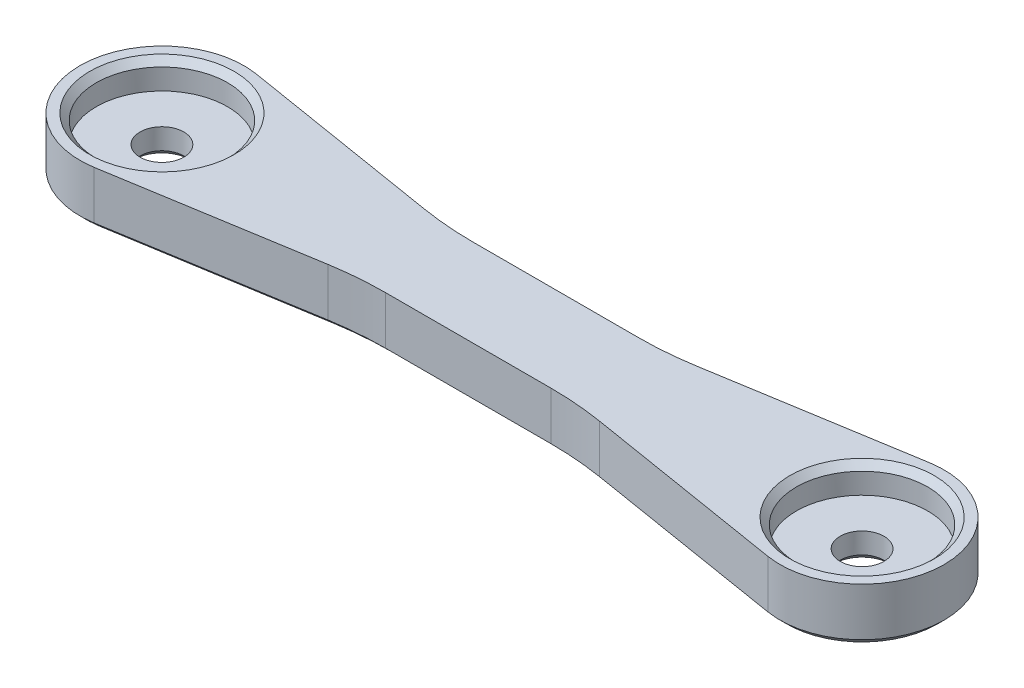
ISO-10303-21;
HEADER;
FILE_DESCRIPTION(('STEP AP214'),'2;1');
FILE_NAME('part.step','',(''),(''),'','','');
FILE_SCHEMA(('AUTOMOTIVE_DESIGN { 1 0 10303 214 1 1 1 1 }'));
ENDSEC;
DATA;
#1=APPLICATION_CONTEXT('core data for automotive mechanical design processes');
#2=APPLICATION_PROTOCOL_DEFINITION('international standard','automotive_design',2000,#1);
#3=PRODUCT_CONTEXT('',#1,'mechanical');
#4=PRODUCT('Part','Part','',(#3));
#5=PRODUCT_RELATED_PRODUCT_CATEGORY('part','',(#4));
#6=PRODUCT_DEFINITION_FORMATION('','',#4);
#7=PRODUCT_DEFINITION_CONTEXT('part definition',#1,'design');
#8=PRODUCT_DEFINITION('design','',#6,#7);
#9=PRODUCT_DEFINITION_SHAPE('','',#8);
#10=(LENGTH_UNIT() NAMED_UNIT(*) SI_UNIT(.MILLI.,.METRE.));
#11=(NAMED_UNIT(*) PLANE_ANGLE_UNIT() SI_UNIT($,.RADIAN.));
#12=(NAMED_UNIT(*) SI_UNIT($,.STERADIAN.) SOLID_ANGLE_UNIT());
#13=UNCERTAINTY_MEASURE_WITH_UNIT(LENGTH_MEASURE(1.E-05),#10,'distance_accuracy_value','');
#14=(GEOMETRIC_REPRESENTATION_CONTEXT(3) GLOBAL_UNCERTAINTY_ASSIGNED_CONTEXT((#13)) GLOBAL_UNIT_ASSIGNED_CONTEXT((#10,
#11,#12)) REPRESENTATION_CONTEXT('',''));
#15=CARTESIAN_POINT('',(0.,0.,0.));
#16=DIRECTION('',(0.,0.,1.));
#17=DIRECTION('',(1.,0.,0.));
#18=AXIS2_PLACEMENT_3D('',#15,#16,#17);
#19=CARTESIAN_POINT('',(-32.,-5.,0.));
#20=DIRECTION('',(0.,1.,0.));
#21=DIRECTION('',(0.,0.,1.));
#22=AXIS2_PLACEMENT_3D('',#19,#20,#21);
#23=CYLINDRICAL_SURFACE('',#22,2.);
#24=CARTESIAN_POINT('',(-32.,-4.39999999999999,0.));
#25=DIRECTION('',(0.,-1.,0.));
#26=DIRECTION('',(0.,0.,-1.));
#27=AXIS2_PLACEMENT_3D('',#24,#25,#26);
#28=CIRCLE('',#27,2.);
#29=CARTESIAN_POINT('',(-32.,-4.39999999999999,-2.));
#30=VERTEX_POINT('',#29);
#31=EDGE_CURVE('E343',#30,#30,#28,.T.);
#32=ORIENTED_EDGE('',*,*,#31,.T.);
#33=EDGE_LOOP('',(#32));
#34=FACE_BOUND('',#33,.T.);
#35=CARTESIAN_POINT('',(-32.,-2.5,0.));
#36=DIRECTION('',(0.,1.,0.));
#37=DIRECTION('',(0.,0.,1.));
#38=AXIS2_PLACEMENT_3D('',#35,#36,#37);
#39=CIRCLE('',#38,2.);
#40=CARTESIAN_POINT('',(-32.,-2.5,2.00000000000001));
#41=VERTEX_POINT('',#40);
#42=EDGE_CURVE('E384',#41,#41,#39,.T.);
#43=ORIENTED_EDGE('',*,*,#42,.T.);
#44=EDGE_LOOP('',(#43));
#45=FACE_BOUND('',#44,.T.);
#46=ADVANCED_FACE('F91',(#34,#45),#23,.F.);
#47=CARTESIAN_POINT('',(32.,-5.,0.));
#48=DIRECTION('',(0.,1.,0.));
#49=DIRECTION('',(0.,0.,1.));
#50=AXIS2_PLACEMENT_3D('',#47,#48,#49);
#51=CYLINDRICAL_SURFACE('',#50,2.);
#52=CARTESIAN_POINT('',(32.,-4.39999999999999,0.));
#53=DIRECTION('',(0.,-1.,0.));
#54=DIRECTION('',(0.,0.,-1.));
#55=AXIS2_PLACEMENT_3D('',#52,#53,#54);
#56=CIRCLE('',#55,2.);
#57=CARTESIAN_POINT('',(32.,-4.39999999999999,-2.00000000000001));
#58=VERTEX_POINT('',#57);
#59=EDGE_CURVE('E346',#58,#58,#56,.T.);
#60=ORIENTED_EDGE('',*,*,#59,.T.);
#61=EDGE_LOOP('',(#60));
#62=FACE_BOUND('',#61,.T.);
#63=CARTESIAN_POINT('',(32.,-2.5,0.));
#64=DIRECTION('',(0.,1.,0.));
#65=DIRECTION('',(0.,0.,1.));
#66=AXIS2_PLACEMENT_3D('',#63,#64,#65);
#67=CIRCLE('',#66,2.);
#68=CARTESIAN_POINT('',(32.,-2.5,2.));
#69=VERTEX_POINT('',#68);
#70=EDGE_CURVE('E409',#69,#69,#67,.T.);
#71=ORIENTED_EDGE('',*,*,#70,.T.);
#72=EDGE_LOOP('',(#71));
#73=FACE_BOUND('',#72,.T.);
#74=ADVANCED_FACE('F438',(#62,#73),#51,.F.);
#75=CARTESIAN_POINT('',(-30.7889224659765,-5.,-7.40157356287048));
#76=DIRECTION('',(-0.161477004536472,0.,0.9868764750494));
#77=DIRECTION('',(0.9868764750494,0.,0.161477004536472));
#78=AXIS2_PLACEMENT_3D('',#75,#76,#77);
#79=PLANE('',#78);
#80=DIRECTION('',(0.,1.,0.));
#81=VECTOR('',#80,1.);
#82=CARTESIAN_POINT('',(-12.4061564828965,-5.,-4.39370574851801));
#83=LINE('',#82,#81);
#84=CARTESIAN_POINT('',(-12.4061564828965,0.,-4.39370574851801));
#85=VERTEX_POINT('',#84);
#86=CARTESIAN_POINT('',(-12.4061564828965,-4.39999999999999,-4.39370574851801));
#87=VERTEX_POINT('',#86);
#88=EDGE_CURVE('E270',#85,#87,#83,.F.);
#89=ORIENTED_EDGE('',*,*,#88,.T.);
#90=DIRECTION('',(-0.9868764750494,0.,-0.161477004536472));
#91=VECTOR('',#90,1.);
#92=CARTESIAN_POINT('',(-30.7889224659765,-4.39999999999999,-7.40157356287048));
#93=LINE('',#92,#91);
#94=CARTESIAN_POINT('',(-30.7889224659765,-4.39999999999999,-7.40157356287048));
#95=VERTEX_POINT('',#94);
#96=EDGE_CURVE('E341',#87,#95,#93,.T.);
#97=ORIENTED_EDGE('',*,*,#96,.T.);
#98=DIRECTION('',(0.,1.,0.));
#99=VECTOR('',#98,1.);
#100=CARTESIAN_POINT('',(-30.7889224659765,-5.,-7.40157356287048));
#101=LINE('',#100,#99);
#102=CARTESIAN_POINT('',(-30.7889224659765,0.,-7.40157356287048));
#103=VERTEX_POINT('',#102);
#104=EDGE_CURVE('E260',#95,#103,#101,.T.);
#105=ORIENTED_EDGE('',*,*,#104,.T.);
#106=DIRECTION('',(0.986876475049399,0.,0.161477004536472));
#107=VECTOR('',#106,1.);
#108=CARTESIAN_POINT('',(-30.7889224659765,0.,-7.40157356287048));
#109=LINE('',#108,#107);
#110=EDGE_CURVE('E246',#103,#85,#109,.T.);
#111=ORIENTED_EDGE('',*,*,#110,.T.);
#112=EDGE_LOOP('',(#89,#97,#105,#111));
#113=FACE_BOUND('',#112,.T.);
#114=ADVANCED_FACE('F444',(#113),#79,.F.);
#115=CARTESIAN_POINT('',(-10.,-5.,-4.));
#116=DIRECTION('',(0.,0.,1.));
#117=DIRECTION('',(1.,0.,0.));
#118=AXIS2_PLACEMENT_3D('',#115,#116,#117);
#119=PLANE('',#118);
#120=DIRECTION('',(0.,1.,0.));
#121=VECTOR('',#120,1.);
#122=CARTESIAN_POINT('',(7.56184634680233,-5.,-4.));
#123=LINE('',#122,#121);
#124=CARTESIAN_POINT('',(7.56184634680233,0.,-4.));
#125=VERTEX_POINT('',#124);
#126=CARTESIAN_POINT('',(7.56184634680233,-4.39999999999999,-4.));
#127=VERTEX_POINT('',#126);
#128=EDGE_CURVE('E268',#125,#127,#123,.F.);
#129=ORIENTED_EDGE('',*,*,#128,.T.);
#130=DIRECTION('',(-1.,0.,0.));
#131=VECTOR('',#130,1.);
#132=CARTESIAN_POINT('',(-7.56184634680231,-4.39999999999999,-4.));
#133=LINE('',#132,#131);
#134=CARTESIAN_POINT('',(-7.56184634680231,-4.39999999999999,-4.));
#135=VERTEX_POINT('',#134);
#136=EDGE_CURVE('E114',#127,#135,#133,.T.);
#137=ORIENTED_EDGE('',*,*,#136,.T.);
#138=DIRECTION('',(0.,1.,0.));
#139=VECTOR('',#138,1.);
#140=CARTESIAN_POINT('',(-7.56184634680231,0.,-4.));
#141=LINE('',#140,#139);
#142=CARTESIAN_POINT('',(-7.56184634680231,0.,-4.));
#143=VERTEX_POINT('',#142);
#144=EDGE_CURVE('E266',#135,#143,#141,.T.);
#145=ORIENTED_EDGE('',*,*,#144,.T.);
#146=DIRECTION('',(1.,0.,0.));
#147=VECTOR('',#146,1.);
#148=CARTESIAN_POINT('',(-10.,0.,-4.));
#149=LINE('',#148,#147);
#150=EDGE_CURVE('E243',#143,#125,#149,.T.);
#151=ORIENTED_EDGE('',*,*,#150,.T.);
#152=EDGE_LOOP('',(#129,#137,#145,#151));
#153=FACE_BOUND('',#152,.T.);
#154=ADVANCED_FACE('F474',(#153),#119,.F.);
#155=CARTESIAN_POINT('',(30.7889224659764,-5.,-7.40157356287052));
#156=DIRECTION('',(-0.161477004536474,0.,-0.986876475049399));
#157=DIRECTION('',(-0.986876475049399,0.,0.161477004536474));
#158=AXIS2_PLACEMENT_3D('',#155,#156,#157);
#159=PLANE('',#158);
#160=DIRECTION('',(0.,1.,0.));
#161=VECTOR('',#160,1.);
#162=CARTESIAN_POINT('',(30.7889224659764,-5.,-7.40157356287051));
#163=LINE('',#162,#161);
#164=CARTESIAN_POINT('',(30.7889224659764,-4.39999999999999,-7.40157356287051));
#165=VERTEX_POINT('',#164);
#166=CARTESIAN_POINT('',(30.7889224659764,0.,-7.40157356287051));
#167=VERTEX_POINT('',#166);
#168=EDGE_CURVE('E218',#165,#167,#163,.T.);
#169=ORIENTED_EDGE('',*,*,#168,.F.);
#170=DIRECTION('',(-0.986876475049399,0.,0.161477004536474));
#171=VECTOR('',#170,1.);
#172=CARTESIAN_POINT('',(30.7889224659764,-4.39999999999999,-7.40157356287052));
#173=LINE('',#172,#171);
#174=CARTESIAN_POINT('',(12.4061564828965,-4.39999999999999,-4.39370574851802));
#175=VERTEX_POINT('',#174);
#176=EDGE_CURVE('E335',#165,#175,#173,.T.);
#177=ORIENTED_EDGE('',*,*,#176,.T.);
#178=DIRECTION('',(0.,1.,0.));
#179=VECTOR('',#178,1.);
#180=CARTESIAN_POINT('',(12.4061564828965,-5.,-4.39370574851802));
#181=LINE('',#180,#179);
#182=CARTESIAN_POINT('',(12.4061564828965,0.,-4.39370574851803));
#183=VERTEX_POINT('',#182);
#184=EDGE_CURVE('E229',#175,#183,#181,.T.);
#185=ORIENTED_EDGE('',*,*,#184,.T.);
#186=DIRECTION('',(-0.986876475049399,0.,0.161477004536474));
#187=VECTOR('',#186,1.);
#188=CARTESIAN_POINT('',(30.7889224659764,0.,-7.40157356287052));
#189=LINE('',#188,#187);
#190=EDGE_CURVE('E236',#167,#183,#189,.T.);
#191=ORIENTED_EDGE('',*,*,#190,.F.);
#192=EDGE_LOOP('',(#169,#177,#185,#191));
#193=FACE_BOUND('',#192,.T.);
#194=ADVANCED_FACE('F240',(#193),#159,.T.);
#195=CARTESIAN_POINT('',(32.,-5.,0.));
#196=DIRECTION('',(0.,1.,0.));
#197=DIRECTION('',(0.,0.,1.));
#198=AXIS2_PLACEMENT_3D('',#195,#196,#197);
#199=CYLINDRICAL_SURFACE('',#198,7.50000000000001);
#200=DIRECTION('',(0.,1.,0.));
#201=VECTOR('',#200,1.);
#202=CARTESIAN_POINT('',(30.7889224659764,-5.,7.4015735628705));
#203=LINE('',#202,#201);
#204=CARTESIAN_POINT('',(30.7889224659764,-4.39999999999999,7.4015735628705));
#205=VERTEX_POINT('',#204);
#206=CARTESIAN_POINT('',(30.7889224659764,0.,7.4015735628705));
#207=VERTEX_POINT('',#206);
#208=EDGE_CURVE('E230',#205,#207,#203,.T.);
#209=ORIENTED_EDGE('',*,*,#208,.F.);
#210=CARTESIAN_POINT('',(32.,-4.39999999999999,0.));
#211=DIRECTION('',(0.,-1.,0.));
#212=DIRECTION('',(0.,0.,-1.));
#213=AXIS2_PLACEMENT_3D('',#210,#211,#212);
#214=CIRCLE('',#213,7.50000000000001);
#215=EDGE_CURVE('E225',#205,#165,#214,.F.);
#216=ORIENTED_EDGE('',*,*,#215,.T.);
#217=ORIENTED_EDGE('',*,*,#168,.T.);
#218=CARTESIAN_POINT('',(32.,0.,0.));
#219=DIRECTION('',(0.,-1.,0.));
#220=DIRECTION('',(0.,0.,-1.));
#221=AXIS2_PLACEMENT_3D('',#218,#219,#220);
#222=CIRCLE('',#221,7.50000000000001);
#223=EDGE_CURVE('E222',#167,#207,#222,.T.);
#224=ORIENTED_EDGE('',*,*,#223,.T.);
#225=EDGE_LOOP('',(#209,#216,#217,#224));
#226=FACE_BOUND('',#225,.T.);
#227=ADVANCED_FACE('F221',(#226),#199,.T.);
#228=CARTESIAN_POINT('',(30.7889224659764,-5.,7.4015735628705));
#229=DIRECTION('',(0.161477004536473,0.,-0.9868764750494));
#230=DIRECTION('',(-0.9868764750494,0.,-0.161477004536473));
#231=AXIS2_PLACEMENT_3D('',#228,#229,#230);
#232=PLANE('',#231);
#233=DIRECTION('',(0.,1.,0.));
#234=VECTOR('',#233,1.);
#235=CARTESIAN_POINT('',(12.4061564828965,-5.,4.39370574851801));
#236=LINE('',#235,#234);
#237=CARTESIAN_POINT('',(12.4061564828965,0.,4.39370574851801));
#238=VERTEX_POINT('',#237);
#239=CARTESIAN_POINT('',(12.4061564828965,-4.39999999999999,4.39370574851801));
#240=VERTEX_POINT('',#239);
#241=EDGE_CURVE('E277',#238,#240,#236,.F.);
#242=ORIENTED_EDGE('',*,*,#241,.T.);
#243=DIRECTION('',(0.9868764750494,0.,0.161477004536473));
#244=VECTOR('',#243,1.);
#245=CARTESIAN_POINT('',(30.7889224659764,-4.39999999999999,7.4015735628705));
#246=LINE('',#245,#244);
#247=EDGE_CURVE('E332',#240,#205,#246,.T.);
#248=ORIENTED_EDGE('',*,*,#247,.T.);
#249=ORIENTED_EDGE('',*,*,#208,.T.);
#250=DIRECTION('',(-0.986876475049399,0.,-0.161477004536473));
#251=VECTOR('',#250,1.);
#252=CARTESIAN_POINT('',(30.7889224659764,0.,7.4015735628705));
#253=LINE('',#252,#251);
#254=EDGE_CURVE('E238',#207,#238,#253,.T.);
#255=ORIENTED_EDGE('',*,*,#254,.T.);
#256=EDGE_LOOP('',(#242,#248,#249,#255));
#257=FACE_BOUND('',#256,.T.);
#258=ADVANCED_FACE('F465',(#257),#232,.F.);
#259=CARTESIAN_POINT('',(10.,-5.,4.));
#260=DIRECTION('',(0.,0.,-1.));
#261=DIRECTION('',(-1.,0.,0.));
#262=AXIS2_PLACEMENT_3D('',#259,#260,#261);
#263=PLANE('',#262);
#264=DIRECTION('',(0.,1.,0.));
#265=VECTOR('',#264,1.);
#266=CARTESIAN_POINT('',(-7.56184634680234,-5.,4.));
#267=LINE('',#266,#265);
#268=CARTESIAN_POINT('',(-7.56184634680234,0.,4.));
#269=VERTEX_POINT('',#268);
#270=CARTESIAN_POINT('',(-7.56184634680234,-4.39999999999999,4.));
#271=VERTEX_POINT('',#270);
#272=EDGE_CURVE('E272',#269,#271,#267,.F.);
#273=ORIENTED_EDGE('',*,*,#272,.T.);
#274=DIRECTION('',(1.,0.,0.));
#275=VECTOR('',#274,1.);
#276=CARTESIAN_POINT('',(7.5618463468023,-4.39999999999999,4.));
#277=LINE('',#276,#275);
#278=CARTESIAN_POINT('',(7.5618463468023,-4.39999999999999,4.));
#279=VERTEX_POINT('',#278);
#280=EDGE_CURVE('E328',#271,#279,#277,.T.);
#281=ORIENTED_EDGE('',*,*,#280,.T.);
#282=DIRECTION('',(0.,1.,0.));
#283=VECTOR('',#282,1.);
#284=CARTESIAN_POINT('',(7.5618463468023,0.,4.));
#285=LINE('',#284,#283);
#286=CARTESIAN_POINT('',(7.5618463468023,0.,4.));
#287=VERTEX_POINT('',#286);
#288=EDGE_CURVE('E275',#279,#287,#285,.T.);
#289=ORIENTED_EDGE('',*,*,#288,.T.);
#290=DIRECTION('',(-1.,0.,0.));
#291=VECTOR('',#290,1.);
#292=CARTESIAN_POINT('',(10.,0.,4.));
#293=LINE('',#292,#291);
#294=EDGE_CURVE('E251',#287,#269,#293,.T.);
#295=ORIENTED_EDGE('',*,*,#294,.T.);
#296=EDGE_LOOP('',(#273,#281,#289,#295));
#297=FACE_BOUND('',#296,.T.);
#298=ADVANCED_FACE('F461',(#297),#263,.F.);
#299=CARTESIAN_POINT('',(-30.7889224659765,-5.,7.4015735628705));
#300=DIRECTION('',(0.161477004536473,0.,0.9868764750494));
#301=DIRECTION('',(0.9868764750494,0.,-0.161477004536473));
#302=AXIS2_PLACEMENT_3D('',#299,#300,#301);
#303=PLANE('',#302);
#304=DIRECTION('',(0.,1.,0.));
#305=VECTOR('',#304,1.);
#306=CARTESIAN_POINT('',(-30.7889224659765,-5.,7.40157356287051));
#307=LINE('',#306,#305);
#308=CARTESIAN_POINT('',(-30.7889224659765,-4.39999999999999,7.40157356287051));
#309=VERTEX_POINT('',#308);
#310=CARTESIAN_POINT('',(-30.7889224659765,0.,7.40157356287051));
#311=VERTEX_POINT('',#310);
#312=EDGE_CURVE('E262',#309,#311,#307,.T.);
#313=ORIENTED_EDGE('',*,*,#312,.F.);
#314=DIRECTION('',(0.9868764750494,0.,-0.161477004536473));
#315=VECTOR('',#314,1.);
#316=CARTESIAN_POINT('',(-30.7889224659765,-4.39999999999999,7.4015735628705));
#317=LINE('',#316,#315);
#318=CARTESIAN_POINT('',(-12.4061564828965,-4.39999999999999,4.39370574851802));
#319=VERTEX_POINT('',#318);
#320=EDGE_CURVE('E324',#309,#319,#317,.T.);
#321=ORIENTED_EDGE('',*,*,#320,.T.);
#322=DIRECTION('',(0.,1.,0.));
#323=VECTOR('',#322,1.);
#324=CARTESIAN_POINT('',(-12.4061564828965,-5.,4.39370574851802));
#325=LINE('',#324,#323);
#326=CARTESIAN_POINT('',(-12.4061564828965,0.,4.39370574851802));
#327=VERTEX_POINT('',#326);
#328=EDGE_CURVE('E280',#319,#327,#325,.T.);
#329=ORIENTED_EDGE('',*,*,#328,.T.);
#330=DIRECTION('',(0.986876475049399,0.,-0.161477004536473));
#331=VECTOR('',#330,1.);
#332=CARTESIAN_POINT('',(-30.7889224659765,0.,7.4015735628705));
#333=LINE('',#332,#331);
#334=EDGE_CURVE('E254',#311,#327,#333,.T.);
#335=ORIENTED_EDGE('',*,*,#334,.F.);
#336=EDGE_LOOP('',(#313,#321,#329,#335));
#337=FACE_BOUND('',#336,.T.);
#338=ADVANCED_FACE('F457',(#337),#303,.T.);
#339=CARTESIAN_POINT('',(-32.,-5.,0.));
#340=DIRECTION('',(0.,1.,0.));
#341=DIRECTION('',(0.,0.,1.));
#342=AXIS2_PLACEMENT_3D('',#339,#340,#341);
#343=CYLINDRICAL_SURFACE('',#342,7.5);
#344=ORIENTED_EDGE('',*,*,#104,.F.);
#345=CARTESIAN_POINT('',(-32.,-4.39999999999999,0.));
#346=DIRECTION('',(0.,-1.,0.));
#347=DIRECTION('',(0.,0.,-1.));
#348=AXIS2_PLACEMENT_3D('',#345,#346,#347);
#349=CIRCLE('',#348,7.5);
#350=EDGE_CURVE('E290',#95,#309,#349,.F.);
#351=ORIENTED_EDGE('',*,*,#350,.T.);
#352=ORIENTED_EDGE('',*,*,#312,.T.);
#353=CARTESIAN_POINT('',(-32.,0.,0.));
#354=DIRECTION('',(0.,1.,0.));
#355=DIRECTION('',(0.,0.,1.));
#356=AXIS2_PLACEMENT_3D('',#353,#354,#355);
#357=CIRCLE('',#356,7.5);
#358=EDGE_CURVE('E257',#103,#311,#357,.T.);
#359=ORIENTED_EDGE('',*,*,#358,.F.);
#360=EDGE_LOOP('',(#344,#351,#352,#359));
#361=FACE_BOUND('',#360,.T.);
#362=ADVANCED_FACE('F451',(#361),#343,.T.);
#363=CARTESIAN_POINT('',(32.,-5.,0.));
#364=DIRECTION('',(0.,-1.,0.));
#365=DIRECTION('',(0.,0.,-1.));
#366=AXIS2_PLACEMENT_3D('',#363,#364,#365);
#367=PLANE('',#366);
#368=DIRECTION('',(-0.986876475049399,0.,0.161477004536473));
#369=VECTOR('',#368,1.);
#370=CARTESIAN_POINT('',(31.445402659681,-5.,-3.38945517262252));
#371=LINE('',#370,#369);
#372=CARTESIAN_POINT('',(-12.5030426856184,-5.,3.80157986348838));
#373=VERTEX_POINT('',#372);
#374=CARTESIAN_POINT('',(-30.8858086686984,-5.,6.80944767784087));
#375=VERTEX_POINT('',#374);
#376=EDGE_CURVE('E319',#373,#375,#371,.T.);
#377=ORIENTED_EDGE('',*,*,#376,.T.);
#378=CARTESIAN_POINT('',(-32.,-5.,0.));
#379=DIRECTION('',(0.,-1.,0.));
#380=DIRECTION('',(0.,0.,-1.));
#381=AXIS2_PLACEMENT_3D('',#378,#379,#380);
#382=CIRCLE('',#381,6.9);
#383=CARTESIAN_POINT('',(-30.8858086686984,-5.,-6.80944767784085));
#384=VERTEX_POINT('',#383);
#385=EDGE_CURVE('E321',#375,#384,#382,.T.);
#386=ORIENTED_EDGE('',*,*,#385,.T.);
#387=DIRECTION('',(0.9868764750494,0.,0.161477004536472));
#388=VECTOR('',#387,1.);
#389=CARTESIAN_POINT('',(-12.5030426856184,-5.,-3.80157986348837));
#390=LINE('',#389,#388);
#391=CARTESIAN_POINT('',(-12.5030426856184,-5.,-3.80157986348837));
#392=VERTEX_POINT('',#391);
#393=EDGE_CURVE('E299',#384,#392,#390,.T.);
#394=ORIENTED_EDGE('',*,*,#393,.T.);
#395=CARTESIAN_POINT('',(-7.56184634680232,-5.,-34.));
#396=DIRECTION('',(0.,-1.,0.));
#397=DIRECTION('',(0.,0.,-1.));
#398=AXIS2_PLACEMENT_3D('',#395,#396,#397);
#399=CIRCLE('',#398,30.6);
#400=CARTESIAN_POINT('',(-7.56184634680231,-5.,-3.4));
#401=VERTEX_POINT('',#400);
#402=EDGE_CURVE('E301',#392,#401,#399,.F.);
#403=ORIENTED_EDGE('',*,*,#402,.T.);
#404=DIRECTION('',(1.,0.,0.));
#405=VECTOR('',#404,1.);
#406=CARTESIAN_POINT('',(7.56184634680233,-5.,-3.4));
#407=LINE('',#406,#405);
#408=CARTESIAN_POINT('',(7.56184634680233,-5.,-3.4));
#409=VERTEX_POINT('',#408);
#410=EDGE_CURVE('E303',#401,#409,#407,.T.);
#411=ORIENTED_EDGE('',*,*,#410,.T.);
#412=CARTESIAN_POINT('',(7.56184634680232,-5.,-34.));
#413=DIRECTION('',(0.,-1.,0.));
#414=DIRECTION('',(0.,0.,-1.));
#415=AXIS2_PLACEMENT_3D('',#412,#413,#414);
#416=CIRCLE('',#415,30.6);
#417=CARTESIAN_POINT('',(12.5030426856184,-5.,-3.80157986348838));
#418=VERTEX_POINT('',#417);
#419=EDGE_CURVE('E305',#409,#418,#416,.F.);
#420=ORIENTED_EDGE('',*,*,#419,.T.);
#421=DIRECTION('',(0.986876475049399,0.,-0.161477004536474));
#422=VECTOR('',#421,1.);
#423=CARTESIAN_POINT('',(30.8858086686983,-5.,-6.80944767784088));
#424=LINE('',#423,#422);
#425=CARTESIAN_POINT('',(30.8858086686983,-5.,-6.80944767784088));
#426=VERTEX_POINT('',#425);
#427=EDGE_CURVE('E307',#418,#426,#424,.T.);
#428=ORIENTED_EDGE('',*,*,#427,.T.);
#429=CARTESIAN_POINT('',(32.,-5.,0.));
#430=DIRECTION('',(0.,-1.,0.));
#431=DIRECTION('',(0.,0.,-1.));
#432=AXIS2_PLACEMENT_3D('',#429,#430,#431);
#433=CIRCLE('',#432,6.90000000000001);
#434=CARTESIAN_POINT('',(30.8858086686983,-5.,6.80944767784087));
#435=VERTEX_POINT('',#434);
#436=EDGE_CURVE('E309',#426,#435,#433,.T.);
#437=ORIENTED_EDGE('',*,*,#436,.T.);
#438=DIRECTION('',(-0.986876475049399,0.,-0.161477004536473));
#439=VECTOR('',#438,1.);
#440=CARTESIAN_POINT('',(12.5030426856184,-5.,3.80157986348837));
#441=LINE('',#440,#439);
#442=CARTESIAN_POINT('',(12.5030426856184,-5.,3.80157986348837));
#443=VERTEX_POINT('',#442);
#444=EDGE_CURVE('E311',#435,#443,#441,.T.);
#445=ORIENTED_EDGE('',*,*,#444,.T.);
#446=CARTESIAN_POINT('',(7.5618463468023,-5.,34.));
#447=DIRECTION('',(0.,-1.,0.));
#448=DIRECTION('',(0.,0.,-1.));
#449=AXIS2_PLACEMENT_3D('',#446,#447,#448);
#450=CIRCLE('',#449,30.6);
#451=CARTESIAN_POINT('',(7.5618463468023,-5.,3.4));
#452=VERTEX_POINT('',#451);
#453=EDGE_CURVE('E313',#443,#452,#450,.F.);
#454=ORIENTED_EDGE('',*,*,#453,.T.);
#455=DIRECTION('',(-1.,0.,0.));
#456=VECTOR('',#455,1.);
#457=CARTESIAN_POINT('',(-7.56184634680234,-5.,3.4));
#458=LINE('',#457,#456);
#459=CARTESIAN_POINT('',(-7.56184634680234,-5.,3.4));
#460=VERTEX_POINT('',#459);
#461=EDGE_CURVE('E315',#452,#460,#458,.T.);
#462=ORIENTED_EDGE('',*,*,#461,.T.);
#463=CARTESIAN_POINT('',(-7.56184634680233,-5.,34.));
#464=DIRECTION('',(0.,-1.,0.));
#465=DIRECTION('',(0.,0.,-1.));
#466=AXIS2_PLACEMENT_3D('',#463,#464,#465);
#467=CIRCLE('',#466,30.6);
#468=EDGE_CURVE('E317',#460,#373,#467,.F.);
#469=ORIENTED_EDGE('',*,*,#468,.T.);
#470=EDGE_LOOP('',(#377,#386,#394,#403,#411,#420,#428,#437,#445,#454,#462,#469));
#471=FACE_BOUND('',#470,.T.);
#472=CARTESIAN_POINT('',(-32.,-5.,0.));
#473=DIRECTION('',(0.,-1.,0.));
#474=DIRECTION('',(0.,0.,-1.));
#475=AXIS2_PLACEMENT_3D('',#472,#473,#474);
#476=CIRCLE('',#475,2.60000000000001);
#477=CARTESIAN_POINT('',(-32.,-5.,-2.60000000000001));
#478=VERTEX_POINT('',#477);
#479=EDGE_CURVE('E296',#478,#478,#476,.F.);
#480=ORIENTED_EDGE('',*,*,#479,.T.);
#481=EDGE_LOOP('',(#480));
#482=FACE_BOUND('',#481,.T.);
#483=CARTESIAN_POINT('',(32.,-5.,0.));
#484=DIRECTION('',(0.,-1.,0.));
#485=DIRECTION('',(0.,0.,-1.));
#486=AXIS2_PLACEMENT_3D('',#483,#484,#485);
#487=CIRCLE('',#486,2.60000000000001);
#488=CARTESIAN_POINT('',(32.,-5.,-2.60000000000001));
#489=VERTEX_POINT('',#488);
#490=EDGE_CURVE('E293',#489,#489,#487,.F.);
#491=ORIENTED_EDGE('',*,*,#490,.T.);
#492=EDGE_LOOP('',(#491));
#493=FACE_BOUND('',#492,.T.);
#494=ADVANCED_FACE('F448',(#471,#482,#493),#367,.T.);
#495=CARTESIAN_POINT('',(32.,0.,0.));
#496=DIRECTION('',(0.,-1.,0.));
#497=DIRECTION('',(0.,0.,-1.));
#498=AXIS2_PLACEMENT_3D('',#495,#496,#497);
#499=PLANE('',#498);
#500=CARTESIAN_POINT('',(32.,0.,0.));
#501=DIRECTION('',(0.,-1.,0.));
#502=DIRECTION('',(0.,0.,-1.));
#503=AXIS2_PLACEMENT_3D('',#500,#501,#502);
#504=CIRCLE('',#503,6.60000000000002);
#505=CARTESIAN_POINT('',(32.,0.,-6.60000000000002));
#506=VERTEX_POINT('',#505);
#507=EDGE_CURVE('E99',#506,#506,#504,.T.);
#508=ORIENTED_EDGE('',*,*,#507,.T.);
#509=EDGE_LOOP('',(#508));
#510=FACE_BOUND('',#509,.T.);
#511=CARTESIAN_POINT('',(-32.,0.,0.));
#512=DIRECTION('',(0.,-1.,0.));
#513=DIRECTION('',(0.,0.,-1.));
#514=AXIS2_PLACEMENT_3D('',#511,#512,#513);
#515=CIRCLE('',#514,6.59999999999998);
#516=CARTESIAN_POINT('',(-32.,0.,-6.59999999999997));
#517=VERTEX_POINT('',#516);
#518=EDGE_CURVE('E387',#517,#517,#515,.T.);
#519=ORIENTED_EDGE('',*,*,#518,.T.);
#520=EDGE_LOOP('',(#519));
#521=FACE_BOUND('',#520,.T.);
#522=ORIENTED_EDGE('',*,*,#110,.F.);
#523=ORIENTED_EDGE('',*,*,#358,.T.);
#524=ORIENTED_EDGE('',*,*,#334,.T.);
#525=CARTESIAN_POINT('',(-7.56184634680233,0.,34.));
#526=DIRECTION('',(0.,-1.,0.));
#527=DIRECTION('',(0.,0.,-1.));
#528=AXIS2_PLACEMENT_3D('',#525,#526,#527);
#529=CIRCLE('',#528,30.);
#530=EDGE_CURVE('E288',#327,#269,#529,.T.);
#531=ORIENTED_EDGE('',*,*,#530,.T.);
#532=ORIENTED_EDGE('',*,*,#294,.F.);
#533=CARTESIAN_POINT('',(7.5618463468023,0.,34.));
#534=DIRECTION('',(0.,-1.,0.));
#535=DIRECTION('',(0.,0.,-1.));
#536=AXIS2_PLACEMENT_3D('',#533,#534,#535);
#537=CIRCLE('',#536,30.);
#538=EDGE_CURVE('E286',#287,#238,#537,.T.);
#539=ORIENTED_EDGE('',*,*,#538,.T.);
#540=ORIENTED_EDGE('',*,*,#254,.F.);
#541=ORIENTED_EDGE('',*,*,#223,.F.);
#542=ORIENTED_EDGE('',*,*,#190,.T.);
#543=CARTESIAN_POINT('',(7.56184634680232,0.,-34.));
#544=DIRECTION('',(0.,-1.,0.));
#545=DIRECTION('',(0.,0.,-1.));
#546=AXIS2_PLACEMENT_3D('',#543,#544,#545);
#547=CIRCLE('',#546,30.);
#548=EDGE_CURVE('E282',#183,#125,#547,.T.);
#549=ORIENTED_EDGE('',*,*,#548,.T.);
#550=ORIENTED_EDGE('',*,*,#150,.F.);
#551=CARTESIAN_POINT('',(-7.56184634680232,0.,-34.));
#552=DIRECTION('',(0.,-1.,0.));
#553=DIRECTION('',(0.,0.,-1.));
#554=AXIS2_PLACEMENT_3D('',#551,#552,#553);
#555=CIRCLE('',#554,30.);
#556=EDGE_CURVE('E284',#143,#85,#555,.T.);
#557=ORIENTED_EDGE('',*,*,#556,.T.);
#558=EDGE_LOOP('',(#522,#523,#524,#531,#532,#539,#540,#541,#542,#549,#550,#557));
#559=FACE_BOUND('',#558,.T.);
#560=ADVANCED_FACE('F235',(#510,#521,#559),#499,.F.);
#561=CARTESIAN_POINT('',(32.,-2.5,0.));
#562=DIRECTION('',(0.,1.,0.));
#563=DIRECTION('',(0.,0.,1.));
#564=AXIS2_PLACEMENT_3D('',#561,#562,#563);
#565=CYLINDRICAL_SURFACE('',#564,6.);
#566=CARTESIAN_POINT('',(32.,-0.600000000000014,0.));
#567=DIRECTION('',(0.,-1.,0.));
#568=DIRECTION('',(0.,0.,-1.));
#569=AXIS2_PLACEMENT_3D('',#566,#567,#568);
#570=CIRCLE('',#569,6.);
#571=CARTESIAN_POINT('',(32.,-0.600000000000014,-6.));
#572=VERTEX_POINT('',#571);
#573=EDGE_CURVE('E349',#572,#572,#570,.F.);
#574=ORIENTED_EDGE('',*,*,#573,.T.);
#575=EDGE_LOOP('',(#574));
#576=FACE_BOUND('',#575,.T.);
#577=CARTESIAN_POINT('',(32.,-2.5,0.));
#578=DIRECTION('',(0.,1.,0.));
#579=DIRECTION('',(0.,0.,1.));
#580=AXIS2_PLACEMENT_3D('',#577,#578,#579);
#581=CIRCLE('',#580,6.);
#582=CARTESIAN_POINT('',(32.,-2.5,6.));
#583=VERTEX_POINT('',#582);
#584=EDGE_CURVE('E407',#583,#583,#581,.T.);
#585=ORIENTED_EDGE('',*,*,#584,.F.);
#586=EDGE_LOOP('',(#585));
#587=FACE_BOUND('',#586,.T.);
#588=ADVANCED_FACE('F400',(#576,#587),#565,.F.);
#589=CARTESIAN_POINT('',(0.,-2.5,0.));
#590=DIRECTION('',(0.,1.,0.));
#591=DIRECTION('',(0.,0.,1.));
#592=AXIS2_PLACEMENT_3D('',#589,#590,#591);
#593=PLANE('',#592);
#594=ORIENTED_EDGE('',*,*,#70,.F.);
#595=EDGE_LOOP('',(#594));
#596=FACE_BOUND('',#595,.T.);
#597=ORIENTED_EDGE('',*,*,#584,.T.);
#598=EDGE_LOOP('',(#597));
#599=FACE_BOUND('',#598,.T.);
#600=ADVANCED_FACE('F403',(#596,#599),#593,.T.);
#601=CARTESIAN_POINT('',(-32.,-2.5,0.));
#602=DIRECTION('',(0.,1.,0.));
#603=DIRECTION('',(0.,0.,1.));
#604=AXIS2_PLACEMENT_3D('',#601,#602,#603);
#605=CYLINDRICAL_SURFACE('',#604,6.);
#606=CARTESIAN_POINT('',(-32.,-0.599999999999989,0.));
#607=DIRECTION('',(0.,-1.,0.));
#608=DIRECTION('',(0.,0.,-1.));
#609=AXIS2_PLACEMENT_3D('',#606,#607,#608);
#610=CIRCLE('',#609,6.);
#611=CARTESIAN_POINT('',(-32.,-0.599999999999989,-5.99999999999999));
#612=VERTEX_POINT('',#611);
#613=EDGE_CURVE('E12',#612,#612,#610,.F.);
#614=ORIENTED_EDGE('',*,*,#613,.T.);
#615=EDGE_LOOP('',(#614));
#616=FACE_BOUND('',#615,.T.);
#617=CARTESIAN_POINT('',(-32.,-2.5,0.));
#618=DIRECTION('',(0.,1.,0.));
#619=DIRECTION('',(0.,0.,1.));
#620=AXIS2_PLACEMENT_3D('',#617,#618,#619);
#621=CIRCLE('',#620,6.);
#622=CARTESIAN_POINT('',(-32.,-2.5,6.));
#623=VERTEX_POINT('',#622);
#624=EDGE_CURVE('E413',#623,#623,#621,.T.);
#625=ORIENTED_EDGE('',*,*,#624,.F.);
#626=EDGE_LOOP('',(#625));
#627=FACE_BOUND('',#626,.T.);
#628=ADVANCED_FACE('F423',(#616,#627),#605,.F.);
#629=CARTESIAN_POINT('',(0.,-2.5,0.));
#630=DIRECTION('',(0.,1.,0.));
#631=DIRECTION('',(0.,0.,1.));
#632=AXIS2_PLACEMENT_3D('',#629,#630,#631);
#633=PLANE('',#632);
#634=ORIENTED_EDGE('',*,*,#42,.F.);
#635=EDGE_LOOP('',(#634));
#636=FACE_BOUND('',#635,.T.);
#637=ORIENTED_EDGE('',*,*,#624,.T.);
#638=EDGE_LOOP('',(#637));
#639=FACE_BOUND('',#638,.T.);
#640=ADVANCED_FACE('F421',(#636,#639),#633,.T.);
#641=CARTESIAN_POINT('',(7.56184634680232,-5.,-34.));
#642=DIRECTION('',(0.,1.,0.));
#643=DIRECTION('',(0.,0.,1.));
#644=AXIS2_PLACEMENT_3D('',#641,#642,#643);
#645=CYLINDRICAL_SURFACE('',#644,30.);
#646=ORIENTED_EDGE('',*,*,#184,.F.);
#647=CARTESIAN_POINT('',(7.56184634680232,-4.39999999999999,-34.));
#648=DIRECTION('',(0.,-1.,0.));
#649=DIRECTION('',(0.,0.,-1.));
#650=AXIS2_PLACEMENT_3D('',#647,#648,#649);
#651=CIRCLE('',#650,30.);
#652=EDGE_CURVE('E337',#175,#127,#651,.T.);
#653=ORIENTED_EDGE('',*,*,#652,.T.);
#654=ORIENTED_EDGE('',*,*,#128,.F.);
#655=ORIENTED_EDGE('',*,*,#548,.F.);
#656=EDGE_LOOP('',(#646,#653,#654,#655));
#657=FACE_BOUND('',#656,.T.);
#658=ADVANCED_FACE('F431',(#657),#645,.F.);
#659=CARTESIAN_POINT('',(-7.56184634680232,-5.,-34.));
#660=DIRECTION('',(0.,-1.,0.));
#661=DIRECTION('',(0.,0.,-1.));
#662=AXIS2_PLACEMENT_3D('',#659,#660,#661);
#663=CYLINDRICAL_SURFACE('',#662,30.);
#664=ORIENTED_EDGE('',*,*,#144,.F.);
#665=CARTESIAN_POINT('',(-7.56184634680232,-4.39999999999999,-34.));
#666=DIRECTION('',(0.,-1.,0.));
#667=DIRECTION('',(0.,0.,-1.));
#668=AXIS2_PLACEMENT_3D('',#665,#666,#667);
#669=CIRCLE('',#668,30.);
#670=EDGE_CURVE('E106',#135,#87,#669,.T.);
#671=ORIENTED_EDGE('',*,*,#670,.T.);
#672=ORIENTED_EDGE('',*,*,#88,.F.);
#673=ORIENTED_EDGE('',*,*,#556,.F.);
#674=EDGE_LOOP('',(#664,#671,#672,#673));
#675=FACE_BOUND('',#674,.T.);
#676=ADVANCED_FACE('F482',(#675),#663,.F.);
#677=CARTESIAN_POINT('',(7.5618463468023,-5.,34.));
#678=DIRECTION('',(0.,-1.,0.));
#679=DIRECTION('',(0.,0.,-1.));
#680=AXIS2_PLACEMENT_3D('',#677,#678,#679);
#681=CYLINDRICAL_SURFACE('',#680,30.);
#682=ORIENTED_EDGE('',*,*,#288,.F.);
#683=CARTESIAN_POINT('',(7.5618463468023,-4.39999999999999,34.));
#684=DIRECTION('',(0.,-1.,0.));
#685=DIRECTION('',(0.,0.,-1.));
#686=AXIS2_PLACEMENT_3D('',#683,#684,#685);
#687=CIRCLE('',#686,30.);
#688=EDGE_CURVE('E330',#279,#240,#687,.T.);
#689=ORIENTED_EDGE('',*,*,#688,.T.);
#690=ORIENTED_EDGE('',*,*,#241,.F.);
#691=ORIENTED_EDGE('',*,*,#538,.F.);
#692=EDGE_LOOP('',(#682,#689,#690,#691));
#693=FACE_BOUND('',#692,.T.);
#694=ADVANCED_FACE('F486',(#693),#681,.F.);
#695=CARTESIAN_POINT('',(-7.56184634680233,-5.,34.));
#696=DIRECTION('',(0.,1.,0.));
#697=DIRECTION('',(0.,0.,1.));
#698=AXIS2_PLACEMENT_3D('',#695,#696,#697);
#699=CYLINDRICAL_SURFACE('',#698,30.);
#700=ORIENTED_EDGE('',*,*,#328,.F.);
#701=CARTESIAN_POINT('',(-7.56184634680233,-4.39999999999999,34.));
#702=DIRECTION('',(0.,-1.,0.));
#703=DIRECTION('',(0.,0.,-1.));
#704=AXIS2_PLACEMENT_3D('',#701,#702,#703);
#705=CIRCLE('',#704,30.);
#706=EDGE_CURVE('E326',#319,#271,#705,.T.);
#707=ORIENTED_EDGE('',*,*,#706,.T.);
#708=ORIENTED_EDGE('',*,*,#272,.F.);
#709=ORIENTED_EDGE('',*,*,#530,.F.);
#710=EDGE_LOOP('',(#700,#707,#708,#709));
#711=FACE_BOUND('',#710,.T.);
#712=ADVANCED_FACE('F489',(#711),#699,.F.);
#713=CARTESIAN_POINT('',(32.,-5.,0.));
#714=DIRECTION('',(0.,1.,0.));
#715=DIRECTION('',(0.,0.,1.));
#716=AXIS2_PLACEMENT_3D('',#713,#714,#715);
#717=CONICAL_SURFACE('',#716,6.90000000000001,0.78539816339744);
#718=DIRECTION('',(-0.114181484913432,0.707106781186553,0.697827047700901));
#719=VECTOR('',#718,1.);
#720=CARTESIAN_POINT('',(30.8858086686983,-5.,6.80944767784087));
#721=LINE('',#720,#719);
#722=EDGE_CURVE('E378',#435,#205,#721,.T.);
#723=ORIENTED_EDGE('',*,*,#722,.F.);
#724=ORIENTED_EDGE('',*,*,#436,.F.);
#725=DIRECTION('',(0.114181484913432,-0.707106781186553,0.697827047700901));
#726=VECTOR('',#725,1.);
#727=CARTESIAN_POINT('',(30.7889224659764,-4.39999999999999,-7.40157356287051));
#728=LINE('',#727,#726);
#729=EDGE_CURVE('E381',#165,#426,#728,.T.);
#730=ORIENTED_EDGE('',*,*,#729,.F.);
#731=ORIENTED_EDGE('',*,*,#215,.F.);
#732=EDGE_LOOP('',(#723,#724,#730,#731));
#733=FACE_BOUND('',#732,.T.);
#734=ADVANCED_FACE('F493',(#733),#717,.T.);
#735=CARTESIAN_POINT('',(30.7889224659764,-4.39999999999999,-7.40157356287052));
#736=DIRECTION('',(0.114181484913433,0.70710678118654,0.697827047700914));
#737=DIRECTION('',(-0.986876475049399,0.,0.161477004536474));
#738=AXIS2_PLACEMENT_3D('',#735,#736,#737);
#739=PLANE('',#738);
#740=ORIENTED_EDGE('',*,*,#729,.T.);
#741=ORIENTED_EDGE('',*,*,#427,.F.);
#742=DIRECTION('',(0.11418148491343,-0.707106781186554,0.697827047700901));
#743=VECTOR('',#742,1.);
#744=CARTESIAN_POINT('',(12.4061564828965,-4.39999999999999,-4.39370574851802));
#745=LINE('',#744,#743);
#746=EDGE_CURVE('E375',#175,#418,#745,.T.);
#747=ORIENTED_EDGE('',*,*,#746,.F.);
#748=ORIENTED_EDGE('',*,*,#176,.F.);
#749=EDGE_LOOP('',(#740,#741,#747,#748));
#750=FACE_BOUND('',#749,.T.);
#751=ADVANCED_FACE('F535',(#750),#739,.F.);
#752=CARTESIAN_POINT('',(30.8858086686983,-5.,6.80944767784086));
#753=DIRECTION('',(-0.114181484913432,-0.707106781186541,0.697827047700914));
#754=DIRECTION('',(0.9868764750494,0.,0.161477004536473));
#755=AXIS2_PLACEMENT_3D('',#752,#753,#754);
#756=PLANE('',#755);
#757=ORIENTED_EDGE('',*,*,#722,.T.);
#758=ORIENTED_EDGE('',*,*,#247,.F.);
#759=DIRECTION('',(-0.11418148491343,0.707106781186554,0.697827047700901));
#760=VECTOR('',#759,1.);
#761=CARTESIAN_POINT('',(12.5030426856184,-5.,3.80157986348837));
#762=LINE('',#761,#760);
#763=EDGE_CURVE('E372',#443,#240,#762,.T.);
#764=ORIENTED_EDGE('',*,*,#763,.F.);
#765=ORIENTED_EDGE('',*,*,#444,.F.);
#766=EDGE_LOOP('',(#757,#758,#764,#765));
#767=FACE_BOUND('',#766,.T.);
#768=ADVANCED_FACE('F531',(#767),#756,.T.);
#769=CARTESIAN_POINT('',(7.56184634680232,-5.,-34.));
#770=DIRECTION('',(0.,-1.,0.));
#771=DIRECTION('',(0.,0.,-1.));
#772=AXIS2_PLACEMENT_3D('',#769,#770,#771);
#773=CONICAL_SURFACE('',#772,30.6,0.78539816339744);
#774=ORIENTED_EDGE('',*,*,#746,.T.);
#775=ORIENTED_EDGE('',*,*,#419,.F.);
#776=DIRECTION('',(0.,-0.707106781186554,0.707106781186541));
#777=VECTOR('',#776,1.);
#778=CARTESIAN_POINT('',(7.56184634680233,-4.39999999999999,-4.));
#779=LINE('',#778,#777);
#780=EDGE_CURVE('E369',#127,#409,#779,.T.);
#781=ORIENTED_EDGE('',*,*,#780,.F.);
#782=ORIENTED_EDGE('',*,*,#652,.F.);
#783=EDGE_LOOP('',(#774,#775,#781,#782));
#784=FACE_BOUND('',#783,.T.);
#785=ADVANCED_FACE('F527',(#784),#773,.F.);
#786=CARTESIAN_POINT('',(7.5618463468023,-5.,34.));
#787=DIRECTION('',(0.,-1.,0.));
#788=DIRECTION('',(0.,0.,-1.));
#789=AXIS2_PLACEMENT_3D('',#786,#787,#788);
#790=CONICAL_SURFACE('',#789,30.6,0.78539816339744);
#791=ORIENTED_EDGE('',*,*,#763,.T.);
#792=ORIENTED_EDGE('',*,*,#688,.F.);
#793=DIRECTION('',(0.,0.707106781186554,0.707106781186541));
#794=VECTOR('',#793,1.);
#795=CARTESIAN_POINT('',(7.5618463468023,-5.,3.4));
#796=LINE('',#795,#794);
#797=EDGE_CURVE('E366',#452,#279,#796,.T.);
#798=ORIENTED_EDGE('',*,*,#797,.F.);
#799=ORIENTED_EDGE('',*,*,#453,.F.);
#800=EDGE_LOOP('',(#791,#792,#798,#799));
#801=FACE_BOUND('',#800,.T.);
#802=ADVANCED_FACE('F523',(#801),#790,.F.);
#803=CARTESIAN_POINT('',(32.,-5.,-3.40000000000001));
#804=DIRECTION('',(0.,-0.707106781186541,-0.707106781186554));
#805=DIRECTION('',(-1.,0.,0.));
#806=AXIS2_PLACEMENT_3D('',#803,#804,#805);
#807=PLANE('',#806);
#808=ORIENTED_EDGE('',*,*,#780,.T.);
#809=ORIENTED_EDGE('',*,*,#410,.F.);
#810=DIRECTION('',(0.,-0.707106781186554,0.707106781186541));
#811=VECTOR('',#810,1.);
#812=CARTESIAN_POINT('',(-7.56184634680231,-4.39999999999999,-4.));
#813=LINE('',#812,#811);
#814=EDGE_CURVE('E363',#135,#401,#813,.T.);
#815=ORIENTED_EDGE('',*,*,#814,.F.);
#816=ORIENTED_EDGE('',*,*,#136,.F.);
#817=EDGE_LOOP('',(#808,#809,#815,#816));
#818=FACE_BOUND('',#817,.T.);
#819=ADVANCED_FACE('F519',(#818),#807,.T.);
#820=CARTESIAN_POINT('',(32.,-5.,3.4));
#821=DIRECTION('',(0.,-0.707106781186541,0.707106781186554));
#822=DIRECTION('',(1.,0.,0.));
#823=AXIS2_PLACEMENT_3D('',#820,#821,#822);
#824=PLANE('',#823);
#825=ORIENTED_EDGE('',*,*,#797,.T.);
#826=ORIENTED_EDGE('',*,*,#280,.F.);
#827=DIRECTION('',(0.,0.707106781186554,0.707106781186541));
#828=VECTOR('',#827,1.);
#829=CARTESIAN_POINT('',(-7.56184634680234,-5.,3.4));
#830=LINE('',#829,#828);
#831=EDGE_CURVE('E360',#460,#271,#830,.T.);
#832=ORIENTED_EDGE('',*,*,#831,.F.);
#833=ORIENTED_EDGE('',*,*,#461,.F.);
#834=EDGE_LOOP('',(#825,#826,#832,#833));
#835=FACE_BOUND('',#834,.T.);
#836=ADVANCED_FACE('F515',(#835),#824,.T.);
#837=CARTESIAN_POINT('',(-7.56184634680232,-5.,-34.));
#838=DIRECTION('',(0.,-1.,0.));
#839=DIRECTION('',(0.,0.,-1.));
#840=AXIS2_PLACEMENT_3D('',#837,#838,#839);
#841=CONICAL_SURFACE('',#840,30.6,0.78539816339744);
#842=ORIENTED_EDGE('',*,*,#814,.T.);
#843=ORIENTED_EDGE('',*,*,#402,.F.);
#844=DIRECTION('',(-0.114181484913431,-0.707106781186552,0.697827047700903));
#845=VECTOR('',#844,1.);
#846=CARTESIAN_POINT('',(-12.4061564828965,-4.39999999999999,-4.39370574851801));
#847=LINE('',#846,#845);
#848=EDGE_CURVE('E357',#87,#392,#847,.T.);
#849=ORIENTED_EDGE('',*,*,#848,.F.);
#850=ORIENTED_EDGE('',*,*,#670,.F.);
#851=EDGE_LOOP('',(#842,#843,#849,#850));
#852=FACE_BOUND('',#851,.T.);
#853=ADVANCED_FACE('F511',(#852),#841,.F.);
#854=CARTESIAN_POINT('',(-7.56184634680233,-5.,34.));
#855=DIRECTION('',(0.,-1.,0.));
#856=DIRECTION('',(0.,0.,-1.));
#857=AXIS2_PLACEMENT_3D('',#854,#855,#856);
#858=CONICAL_SURFACE('',#857,30.6,0.78539816339744);
#859=ORIENTED_EDGE('',*,*,#831,.T.);
#860=ORIENTED_EDGE('',*,*,#706,.F.);
#861=DIRECTION('',(0.11418148491343,0.707106781186553,0.697827047700902));
#862=VECTOR('',#861,1.);
#863=CARTESIAN_POINT('',(-12.5030426856184,-5.,3.80157986348838));
#864=LINE('',#863,#862);
#865=EDGE_CURVE('E354',#373,#319,#864,.T.);
#866=ORIENTED_EDGE('',*,*,#865,.F.);
#867=ORIENTED_EDGE('',*,*,#468,.F.);
#868=EDGE_LOOP('',(#859,#860,#866,#867));
#869=FACE_BOUND('',#868,.T.);
#870=ADVANCED_FACE('F507',(#869),#858,.F.);
#871=CARTESIAN_POINT('',(31.445402659681,-5.,3.38945517262249));
#872=DIRECTION('',(0.114181484913432,-0.707106781186539,-0.697827047700915));
#873=DIRECTION('',(-0.9868764750494,0.,-0.161477004536472));
#874=AXIS2_PLACEMENT_3D('',#871,#872,#873);
#875=PLANE('',#874);
#876=ORIENTED_EDGE('',*,*,#848,.T.);
#877=ORIENTED_EDGE('',*,*,#393,.F.);
#878=DIRECTION('',(-0.114181484913428,-0.707106781186555,0.6978270477009));
#879=VECTOR('',#878,1.);
#880=CARTESIAN_POINT('',(-30.7889224659765,-4.39999999999999,-7.40157356287048));
#881=LINE('',#880,#879);
#882=EDGE_CURVE('E352',#95,#384,#881,.T.);
#883=ORIENTED_EDGE('',*,*,#882,.F.);
#884=ORIENTED_EDGE('',*,*,#96,.F.);
#885=EDGE_LOOP('',(#876,#877,#883,#884));
#886=FACE_BOUND('',#885,.T.);
#887=ADVANCED_FACE('F503',(#886),#875,.T.);
#888=CARTESIAN_POINT('',(-30.7889224659765,-4.39999999999999,7.4015735628705));
#889=DIRECTION('',(-0.114181484913432,0.70710678118654,-0.697827047700914));
#890=DIRECTION('',(0.9868764750494,0.,-0.161477004536473));
#891=AXIS2_PLACEMENT_3D('',#888,#889,#890);
#892=PLANE('',#891);
#893=ORIENTED_EDGE('',*,*,#865,.T.);
#894=ORIENTED_EDGE('',*,*,#320,.F.);
#895=DIRECTION('',(0.114181484913432,0.707106781186555,0.697827047700899));
#896=VECTOR('',#895,1.);
#897=CARTESIAN_POINT('',(-30.8858086686984,-5.,6.80944767784087));
#898=LINE('',#897,#896);
#899=EDGE_CURVE('E350',#375,#309,#898,.T.);
#900=ORIENTED_EDGE('',*,*,#899,.F.);
#901=ORIENTED_EDGE('',*,*,#376,.F.);
#902=EDGE_LOOP('',(#893,#894,#900,#901));
#903=FACE_BOUND('',#902,.T.);
#904=ADVANCED_FACE('F499',(#903),#892,.F.);
#905=CARTESIAN_POINT('',(-32.,-4.39999999999999,0.));
#906=DIRECTION('',(0.,1.,0.));
#907=DIRECTION('',(0.,0.,1.));
#908=AXIS2_PLACEMENT_3D('',#905,#906,#907);
#909=CONICAL_SURFACE('',#908,7.5,0.78539816339744);
#910=ORIENTED_EDGE('',*,*,#882,.T.);
#911=ORIENTED_EDGE('',*,*,#385,.F.);
#912=ORIENTED_EDGE('',*,*,#899,.T.);
#913=ORIENTED_EDGE('',*,*,#350,.F.);
#914=EDGE_LOOP('',(#910,#911,#912,#913));
#915=FACE_BOUND('',#914,.T.);
#916=ADVANCED_FACE('F495',(#915),#909,.T.);
#917=CARTESIAN_POINT('',(-32.,-5.,0.));
#918=DIRECTION('',(0.,-1.,0.));
#919=DIRECTION('',(0.,0.,-1.));
#920=AXIS2_PLACEMENT_3D('',#917,#918,#919);
#921=CONICAL_SURFACE('',#920,2.60000000000001,0.785398163397449);
#922=ORIENTED_EDGE('',*,*,#31,.F.);
#923=EDGE_LOOP('',(#922));
#924=FACE_BOUND('',#923,.T.);
#925=ORIENTED_EDGE('',*,*,#479,.F.);
#926=EDGE_LOOP('',(#925));
#927=FACE_BOUND('',#926,.T.);
#928=ADVANCED_FACE('F498',(#924,#927),#921,.F.);
#929=CARTESIAN_POINT('',(32.,-5.,0.));
#930=DIRECTION('',(0.,-1.,0.));
#931=DIRECTION('',(0.,0.,-1.));
#932=AXIS2_PLACEMENT_3D('',#929,#930,#931);
#933=CONICAL_SURFACE('',#932,2.60000000000001,0.785398163397449);
#934=ORIENTED_EDGE('',*,*,#59,.F.);
#935=EDGE_LOOP('',(#934));
#936=FACE_BOUND('',#935,.T.);
#937=ORIENTED_EDGE('',*,*,#490,.F.);
#938=EDGE_LOOP('',(#937));
#939=FACE_BOUND('',#938,.T.);
#940=ADVANCED_FACE('F397',(#936,#939),#933,.F.);
#941=CARTESIAN_POINT('',(32.,-0.600000000000014,0.));
#942=DIRECTION('',(0.,1.,0.));
#943=DIRECTION('',(0.,0.,1.));
#944=AXIS2_PLACEMENT_3D('',#941,#942,#943);
#945=CONICAL_SURFACE('',#944,6.,0.785398163397454);
#946=ORIENTED_EDGE('',*,*,#507,.F.);
#947=EDGE_LOOP('',(#946));
#948=FACE_BOUND('',#947,.T.);
#949=ORIENTED_EDGE('',*,*,#573,.F.);
#950=EDGE_LOOP('',(#949));
#951=FACE_BOUND('',#950,.T.);
#952=ADVANCED_FACE('F394',(#948,#951),#945,.F.);
#953=CARTESIAN_POINT('',(-32.,-0.599999999999989,0.));
#954=DIRECTION('',(0.,1.,0.));
#955=DIRECTION('',(0.,0.,1.));
#956=AXIS2_PLACEMENT_3D('',#953,#954,#955);
#957=CONICAL_SURFACE('',#956,6.,0.785398163397443);
#958=ORIENTED_EDGE('',*,*,#518,.F.);
#959=EDGE_LOOP('',(#958));
#960=FACE_BOUND('',#959,.T.);
#961=ORIENTED_EDGE('',*,*,#613,.F.);
#962=EDGE_LOOP('',(#961));
#963=FACE_BOUND('',#962,.T.);
#964=ADVANCED_FACE('F93',(#960,#963),#957,.F.);
#965=CLOSED_SHELL('',(#46,#74,#114,#154,#194,#227,#258,#298,#338,#362,#494,#560,#588,#600,#628,
#640,#658,#676,#694,#712,#734,#751,#768,#785,#802,#819,#836,#853,#870,#887,#904,#916,#928,#940,
#952,#964));
#966=MANIFOLD_SOLID_BREP('B2',#965);
#967=ADVANCED_BREP_SHAPE_REPRESENTATION('',(#18,#966),#14);
#968=SHAPE_DEFINITION_REPRESENTATION(#9,#967);
ENDSEC;
END-ISO-10303-21;
